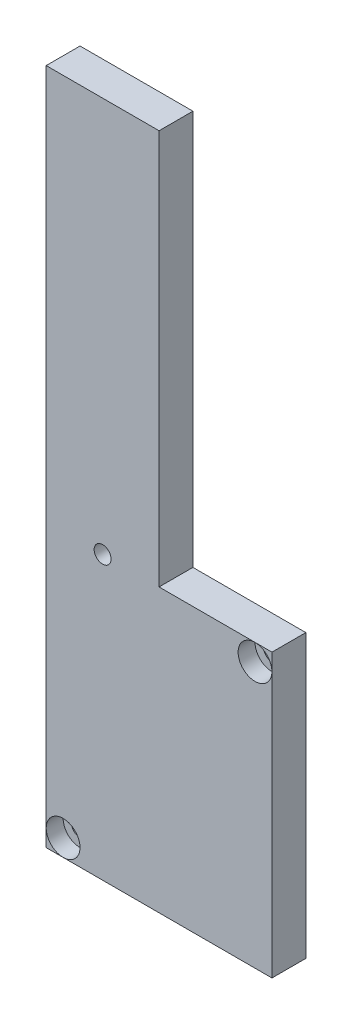
ISO-10303-21;
HEADER;
FILE_DESCRIPTION(('STEP AP214'),'2;1');
FILE_NAME('part.step','',(''),(''),'','','');
FILE_SCHEMA(('AUTOMOTIVE_DESIGN { 1 0 10303 214 1 1 1 1 }'));
ENDSEC;
DATA;
#1=APPLICATION_CONTEXT('core data for automotive mechanical design processes');
#2=APPLICATION_PROTOCOL_DEFINITION('international standard','automotive_design',2000,#1);
#3=PRODUCT_CONTEXT('',#1,'mechanical');
#4=PRODUCT('Part','Part','',(#3));
#5=PRODUCT_RELATED_PRODUCT_CATEGORY('part','',(#4));
#6=PRODUCT_DEFINITION_FORMATION('','',#4);
#7=PRODUCT_DEFINITION_CONTEXT('part definition',#1,'design');
#8=PRODUCT_DEFINITION('design','',#6,#7);
#9=PRODUCT_DEFINITION_SHAPE('','',#8);
#10=(LENGTH_UNIT() NAMED_UNIT(*) SI_UNIT(.MILLI.,.METRE.));
#11=(NAMED_UNIT(*) PLANE_ANGLE_UNIT() SI_UNIT($,.RADIAN.));
#12=(NAMED_UNIT(*) SI_UNIT($,.STERADIAN.) SOLID_ANGLE_UNIT());
#13=UNCERTAINTY_MEASURE_WITH_UNIT(LENGTH_MEASURE(1.E-05),#10,'distance_accuracy_value','');
#14=(GEOMETRIC_REPRESENTATION_CONTEXT(3) GLOBAL_UNCERTAINTY_ASSIGNED_CONTEXT((#13)) GLOBAL_UNIT_ASSIGNED_CONTEXT((#10,
#11,#12)) REPRESENTATION_CONTEXT('',''));
#15=CARTESIAN_POINT('',(0.,0.,0.));
#16=DIRECTION('',(0.,0.,1.));
#17=DIRECTION('',(1.,0.,0.));
#18=AXIS2_PLACEMENT_3D('',#15,#16,#17);
#19=CARTESIAN_POINT('',(37.,47.,0.));
#20=DIRECTION('',(0.,0.,1.));
#21=DIRECTION('',(1.,0.,0.));
#22=AXIS2_PLACEMENT_3D('',#19,#20,#21);
#23=CYLINDRICAL_SURFACE('',#22,1.5);
#24=CARTESIAN_POINT('',(37.,47.,0.));
#25=DIRECTION('',(0.,0.,1.));
#26=DIRECTION('',(1.,0.,0.));
#27=AXIS2_PLACEMENT_3D('',#24,#25,#26);
#28=CIRCLE('',#27,1.5);
#29=CARTESIAN_POINT('',(38.5,47.,0.));
#30=VERTEX_POINT('',#29);
#31=EDGE_CURVE('E125',#30,#30,#28,.T.);
#32=ORIENTED_EDGE('',*,*,#31,.F.);
#33=EDGE_LOOP('',(#32));
#34=FACE_BOUND('',#33,.T.);
#35=CARTESIAN_POINT('',(37.,47.,3.));
#36=DIRECTION('',(0.,0.,1.));
#37=DIRECTION('',(1.,0.,0.));
#38=AXIS2_PLACEMENT_3D('',#35,#36,#37);
#39=CIRCLE('',#38,1.5);
#40=CARTESIAN_POINT('',(38.5,47.,3.));
#41=VERTEX_POINT('',#40);
#42=EDGE_CURVE('E37',#41,#41,#39,.F.);
#43=ORIENTED_EDGE('',*,*,#42,.F.);
#44=EDGE_LOOP('',(#43));
#45=FACE_BOUND('',#44,.T.);
#46=ADVANCED_FACE('F33',(#34,#45),#23,.F.);
#47=CARTESIAN_POINT('',(3.,3.,0.));
#48=DIRECTION('',(0.,0.,1.));
#49=DIRECTION('',(1.,0.,0.));
#50=AXIS2_PLACEMENT_3D('',#47,#48,#49);
#51=CYLINDRICAL_SURFACE('',#50,1.5);
#52=CARTESIAN_POINT('',(3.,3.,0.));
#53=DIRECTION('',(0.,0.,1.));
#54=DIRECTION('',(1.,0.,0.));
#55=AXIS2_PLACEMENT_3D('',#52,#53,#54);
#56=CIRCLE('',#55,1.5);
#57=CARTESIAN_POINT('',(4.5,3.,0.));
#58=VERTEX_POINT('',#57);
#59=EDGE_CURVE('E130',#58,#58,#56,.T.);
#60=ORIENTED_EDGE('',*,*,#59,.F.);
#61=EDGE_LOOP('',(#60));
#62=FACE_BOUND('',#61,.T.);
#63=CARTESIAN_POINT('',(3.,3.,3.));
#64=DIRECTION('',(0.,0.,1.));
#65=DIRECTION('',(1.,0.,0.));
#66=AXIS2_PLACEMENT_3D('',#63,#64,#65);
#67=CIRCLE('',#66,1.5);
#68=CARTESIAN_POINT('',(4.5,3.,3.));
#69=VERTEX_POINT('',#68);
#70=EDGE_CURVE('E123',#69,#69,#67,.F.);
#71=ORIENTED_EDGE('',*,*,#70,.F.);
#72=EDGE_LOOP('',(#71));
#73=FACE_BOUND('',#72,.T.);
#74=ADVANCED_FACE('F169',(#62,#73),#51,.F.);
#75=CARTESIAN_POINT('',(0.,0.,6.));
#76=DIRECTION('',(1.,0.,0.));
#77=DIRECTION('',(0.,0.,-1.));
#78=AXIS2_PLACEMENT_3D('',#75,#76,#77);
#79=PLANE('',#78);
#80=DIRECTION('',(0.,-1.,0.));
#81=VECTOR('',#80,1.);
#82=CARTESIAN_POINT('',(0.,0.,0.));
#83=LINE('',#82,#81);
#84=CARTESIAN_POINT('',(0.,120.,0.));
#85=VERTEX_POINT('',#84);
#86=CARTESIAN_POINT('',(0.,0.,0.));
#87=VERTEX_POINT('',#86);
#88=EDGE_CURVE('E110',#85,#87,#83,.T.);
#89=ORIENTED_EDGE('',*,*,#88,.T.);
#90=DIRECTION('',(0.,0.,-1.));
#91=VECTOR('',#90,1.);
#92=CARTESIAN_POINT('',(0.,0.,6.));
#93=LINE('',#92,#91);
#94=CARTESIAN_POINT('',(0.,0.,6.));
#95=VERTEX_POINT('',#94);
#96=EDGE_CURVE('E11',#95,#87,#93,.T.);
#97=ORIENTED_EDGE('',*,*,#96,.F.);
#98=DIRECTION('',(0.,-1.,0.));
#99=VECTOR('',#98,1.);
#100=CARTESIAN_POINT('',(0.,0.,6.));
#101=LINE('',#100,#99);
#102=CARTESIAN_POINT('',(0.,120.,6.));
#103=VERTEX_POINT('',#102);
#104=EDGE_CURVE('E111',#103,#95,#101,.T.);
#105=ORIENTED_EDGE('',*,*,#104,.F.);
#106=DIRECTION('',(0.,0.,-1.));
#107=VECTOR('',#106,1.);
#108=CARTESIAN_POINT('',(0.,120.,6.));
#109=LINE('',#108,#107);
#110=EDGE_CURVE('E120',#103,#85,#109,.T.);
#111=ORIENTED_EDGE('',*,*,#110,.T.);
#112=EDGE_LOOP('',(#89,#97,#105,#111));
#113=FACE_BOUND('',#112,.T.);
#114=ADVANCED_FACE('F35',(#113),#79,.F.);
#115=CARTESIAN_POINT('',(0.,0.,6.));
#116=DIRECTION('',(0.,1.,0.));
#117=DIRECTION('',(0.,0.,1.));
#118=AXIS2_PLACEMENT_3D('',#115,#116,#117);
#119=PLANE('',#118);
#120=DIRECTION('',(1.,0.,0.));
#121=VECTOR('',#120,1.);
#122=CARTESIAN_POINT('',(0.,0.,0.));
#123=LINE('',#122,#121);
#124=CARTESIAN_POINT('',(40.,0.,0.));
#125=VERTEX_POINT('',#124);
#126=EDGE_CURVE('E116',#87,#125,#123,.T.);
#127=ORIENTED_EDGE('',*,*,#126,.T.);
#128=DIRECTION('',(0.,0.,-1.));
#129=VECTOR('',#128,1.);
#130=CARTESIAN_POINT('',(40.,0.,6.));
#131=LINE('',#130,#129);
#132=CARTESIAN_POINT('',(40.,0.,6.));
#133=VERTEX_POINT('',#132);
#134=EDGE_CURVE('E42',#133,#125,#131,.T.);
#135=ORIENTED_EDGE('',*,*,#134,.F.);
#136=DIRECTION('',(1.,0.,0.));
#137=VECTOR('',#136,1.);
#138=CARTESIAN_POINT('',(0.,0.,6.));
#139=LINE('',#138,#137);
#140=EDGE_CURVE('E82',#95,#133,#139,.T.);
#141=ORIENTED_EDGE('',*,*,#140,.F.);
#142=ORIENTED_EDGE('',*,*,#96,.T.);
#143=EDGE_LOOP('',(#127,#135,#141,#142));
#144=FACE_BOUND('',#143,.T.);
#145=ADVANCED_FACE('F158',(#144),#119,.F.);
#146=CARTESIAN_POINT('',(40.,0.,6.));
#147=DIRECTION('',(-1.,0.,0.));
#148=DIRECTION('',(0.,0.,1.));
#149=AXIS2_PLACEMENT_3D('',#146,#147,#148);
#150=PLANE('',#149);
#151=DIRECTION('',(0.,1.,0.));
#152=VECTOR('',#151,1.);
#153=CARTESIAN_POINT('',(40.,0.,0.));
#154=LINE('',#153,#152);
#155=CARTESIAN_POINT('',(40.,50.,0.));
#156=VERTEX_POINT('',#155);
#157=EDGE_CURVE('E112',#125,#156,#154,.T.);
#158=ORIENTED_EDGE('',*,*,#157,.T.);
#159=DIRECTION('',(0.,0.,1.));
#160=VECTOR('',#159,1.);
#161=CARTESIAN_POINT('',(40.,50.,0.));
#162=LINE('',#161,#160);
#163=CARTESIAN_POINT('',(40.,50.,6.));
#164=VERTEX_POINT('',#163);
#165=EDGE_CURVE('E149',#156,#164,#162,.T.);
#166=ORIENTED_EDGE('',*,*,#165,.T.);
#167=DIRECTION('',(0.,1.,0.));
#168=VECTOR('',#167,1.);
#169=CARTESIAN_POINT('',(40.,0.,6.));
#170=LINE('',#169,#168);
#171=EDGE_CURVE('E154',#133,#164,#170,.T.);
#172=ORIENTED_EDGE('',*,*,#171,.F.);
#173=ORIENTED_EDGE('',*,*,#134,.T.);
#174=EDGE_LOOP('',(#158,#166,#172,#173));
#175=FACE_BOUND('',#174,.T.);
#176=ADVANCED_FACE('F163',(#175),#150,.F.);
#177=CARTESIAN_POINT('',(0.,120.,6.));
#178=DIRECTION('',(0.,-1.,0.));
#179=DIRECTION('',(0.,0.,-1.));
#180=AXIS2_PLACEMENT_3D('',#177,#178,#179);
#181=PLANE('',#180);
#182=DIRECTION('',(-1.,0.,0.));
#183=VECTOR('',#182,1.);
#184=CARTESIAN_POINT('',(0.,120.,6.));
#185=LINE('',#184,#183);
#186=CARTESIAN_POINT('',(20.,120.,6.));
#187=VERTEX_POINT('',#186);
#188=EDGE_CURVE('E59',#187,#103,#185,.T.);
#189=ORIENTED_EDGE('',*,*,#188,.F.);
#190=DIRECTION('',(0.,0.,1.));
#191=VECTOR('',#190,1.);
#192=CARTESIAN_POINT('',(20.,120.,0.));
#193=LINE('',#192,#191);
#194=CARTESIAN_POINT('',(20.,120.,0.));
#195=VERTEX_POINT('',#194);
#196=EDGE_CURVE('E100',#195,#187,#193,.T.);
#197=ORIENTED_EDGE('',*,*,#196,.F.);
#198=DIRECTION('',(-1.,0.,0.));
#199=VECTOR('',#198,1.);
#200=CARTESIAN_POINT('',(0.,120.,0.));
#201=LINE('',#200,#199);
#202=EDGE_CURVE('E77',#195,#85,#201,.T.);
#203=ORIENTED_EDGE('',*,*,#202,.T.);
#204=ORIENTED_EDGE('',*,*,#110,.F.);
#205=EDGE_LOOP('',(#189,#197,#203,#204));
#206=FACE_BOUND('',#205,.T.);
#207=ADVANCED_FACE('F105',(#206),#181,.F.);
#208=CARTESIAN_POINT('',(0.,0.,6.));
#209=DIRECTION('',(0.,0.,-1.));
#210=DIRECTION('',(-1.,0.,0.));
#211=AXIS2_PLACEMENT_3D('',#208,#209,#210);
#212=PLANE('',#211);
#213=CARTESIAN_POINT('',(10.,50.,6.));
#214=DIRECTION('',(0.,0.,1.));
#215=DIRECTION('',(1.,0.,0.));
#216=AXIS2_PLACEMENT_3D('',#213,#214,#215);
#217=CIRCLE('',#216,1.5);
#218=CARTESIAN_POINT('',(11.5,50.,6.));
#219=VERTEX_POINT('',#218);
#220=EDGE_CURVE('E309',#219,#219,#217,.T.);
#221=ORIENTED_EDGE('',*,*,#220,.F.);
#222=EDGE_LOOP('',(#221));
#223=FACE_BOUND('',#222,.T.);
#224=CARTESIAN_POINT('',(37.,47.,6.));
#225=DIRECTION('',(0.,0.,1.));
#226=DIRECTION('',(1.,0.,0.));
#227=AXIS2_PLACEMENT_3D('',#224,#225,#226);
#228=CIRCLE('',#227,2.995);
#229=CARTESIAN_POINT('',(39.995,47.,6.));
#230=VERTEX_POINT('',#229);
#231=EDGE_CURVE('E140',#230,#230,#228,.T.);
#232=ORIENTED_EDGE('',*,*,#231,.F.);
#233=EDGE_LOOP('',(#232));
#234=FACE_BOUND('',#233,.T.);
#235=CARTESIAN_POINT('',(3.,3.,6.));
#236=DIRECTION('',(0.,0.,1.));
#237=DIRECTION('',(1.,0.,0.));
#238=AXIS2_PLACEMENT_3D('',#235,#236,#237);
#239=CIRCLE('',#238,2.995);
#240=CARTESIAN_POINT('',(5.995,3.,6.));
#241=VERTEX_POINT('',#240);
#242=EDGE_CURVE('E133',#241,#241,#239,.T.);
#243=ORIENTED_EDGE('',*,*,#242,.F.);
#244=EDGE_LOOP('',(#243));
#245=FACE_BOUND('',#244,.T.);
#246=ORIENTED_EDGE('',*,*,#171,.T.);
#247=DIRECTION('',(1.,0.,0.));
#248=VECTOR('',#247,1.);
#249=CARTESIAN_POINT('',(40.,50.,6.));
#250=LINE('',#249,#248);
#251=CARTESIAN_POINT('',(20.,50.,6.));
#252=VERTEX_POINT('',#251);
#253=EDGE_CURVE('E103',#252,#164,#250,.T.);
#254=ORIENTED_EDGE('',*,*,#253,.F.);
#255=DIRECTION('',(0.,-1.,0.));
#256=VECTOR('',#255,1.);
#257=CARTESIAN_POINT('',(20.,120.,6.));
#258=LINE('',#257,#256);
#259=EDGE_CURVE('E144',#187,#252,#258,.T.);
#260=ORIENTED_EDGE('',*,*,#259,.F.);
#261=ORIENTED_EDGE('',*,*,#188,.T.);
#262=ORIENTED_EDGE('',*,*,#104,.T.);
#263=ORIENTED_EDGE('',*,*,#140,.T.);
#264=EDGE_LOOP('',(#246,#254,#260,#261,#262,#263));
#265=FACE_BOUND('',#264,.T.);
#266=ADVANCED_FACE('F165',(#223,#234,#245,#265),#212,.F.);
#267=CARTESIAN_POINT('',(0.,0.,0.));
#268=DIRECTION('',(0.,0.,-1.));
#269=DIRECTION('',(-1.,0.,0.));
#270=AXIS2_PLACEMENT_3D('',#267,#268,#269);
#271=PLANE('',#270);
#272=CARTESIAN_POINT('',(10.,50.,0.));
#273=DIRECTION('',(0.,0.,1.));
#274=DIRECTION('',(1.,0.,0.));
#275=AXIS2_PLACEMENT_3D('',#272,#273,#274);
#276=CIRCLE('',#275,1.5);
#277=CARTESIAN_POINT('',(11.5,50.,0.));
#278=VERTEX_POINT('',#277);
#279=EDGE_CURVE('E306',#278,#278,#276,.T.);
#280=ORIENTED_EDGE('',*,*,#279,.T.);
#281=EDGE_LOOP('',(#280));
#282=FACE_BOUND('',#281,.T.);
#283=ORIENTED_EDGE('',*,*,#31,.T.);
#284=EDGE_LOOP('',(#283));
#285=FACE_BOUND('',#284,.T.);
#286=ORIENTED_EDGE('',*,*,#59,.T.);
#287=EDGE_LOOP('',(#286));
#288=FACE_BOUND('',#287,.T.);
#289=DIRECTION('',(1.,0.,0.));
#290=VECTOR('',#289,1.);
#291=CARTESIAN_POINT('',(40.,50.,0.));
#292=LINE('',#291,#290);
#293=CARTESIAN_POINT('',(20.,50.,0.));
#294=VERTEX_POINT('',#293);
#295=EDGE_CURVE('E50',#294,#156,#292,.T.);
#296=ORIENTED_EDGE('',*,*,#295,.T.);
#297=ORIENTED_EDGE('',*,*,#157,.F.);
#298=ORIENTED_EDGE('',*,*,#126,.F.);
#299=ORIENTED_EDGE('',*,*,#88,.F.);
#300=ORIENTED_EDGE('',*,*,#202,.F.);
#301=DIRECTION('',(0.,-1.,0.));
#302=VECTOR('',#301,1.);
#303=CARTESIAN_POINT('',(20.,120.,0.));
#304=LINE('',#303,#302);
#305=EDGE_CURVE('E97',#195,#294,#304,.T.);
#306=ORIENTED_EDGE('',*,*,#305,.T.);
#307=EDGE_LOOP('',(#296,#297,#298,#299,#300,#306));
#308=FACE_BOUND('',#307,.T.);
#309=ADVANCED_FACE('F108',(#282,#285,#288,#308),#271,.T.);
#310=CARTESIAN_POINT('',(40.,50.,0.));
#311=DIRECTION('',(0.,-1.,0.));
#312=DIRECTION('',(0.,0.,-1.));
#313=AXIS2_PLACEMENT_3D('',#310,#311,#312);
#314=PLANE('',#313);
#315=ORIENTED_EDGE('',*,*,#253,.T.);
#316=ORIENTED_EDGE('',*,*,#165,.F.);
#317=ORIENTED_EDGE('',*,*,#295,.F.);
#318=DIRECTION('',(0.,0.,1.));
#319=VECTOR('',#318,1.);
#320=CARTESIAN_POINT('',(20.,50.,0.));
#321=LINE('',#320,#319);
#322=EDGE_CURVE('E101',#294,#252,#321,.T.);
#323=ORIENTED_EDGE('',*,*,#322,.T.);
#324=EDGE_LOOP('',(#315,#316,#317,#323));
#325=FACE_BOUND('',#324,.T.);
#326=ADVANCED_FACE('F187',(#325),#314,.F.);
#327=CARTESIAN_POINT('',(20.,120.,0.));
#328=DIRECTION('',(-1.,0.,0.));
#329=DIRECTION('',(0.,-1.,0.));
#330=AXIS2_PLACEMENT_3D('',#327,#328,#329);
#331=PLANE('',#330);
#332=ORIENTED_EDGE('',*,*,#259,.T.);
#333=ORIENTED_EDGE('',*,*,#322,.F.);
#334=ORIENTED_EDGE('',*,*,#305,.F.);
#335=ORIENTED_EDGE('',*,*,#196,.T.);
#336=EDGE_LOOP('',(#332,#333,#334,#335));
#337=FACE_BOUND('',#336,.T.);
#338=ADVANCED_FACE('F99',(#337),#331,.F.);
#339=CARTESIAN_POINT('',(3.,3.,3.));
#340=DIRECTION('',(0.,0.,1.));
#341=DIRECTION('',(1.,0.,0.));
#342=AXIS2_PLACEMENT_3D('',#339,#340,#341);
#343=PLANE('',#342);
#344=CARTESIAN_POINT('',(3.,3.,3.));
#345=DIRECTION('',(0.,0.,1.));
#346=DIRECTION('',(1.,0.,0.));
#347=AXIS2_PLACEMENT_3D('',#344,#345,#346);
#348=CIRCLE('',#347,2.995);
#349=CARTESIAN_POINT('',(5.995,3.,3.));
#350=VERTEX_POINT('',#349);
#351=EDGE_CURVE('E126',#350,#350,#348,.T.);
#352=ORIENTED_EDGE('',*,*,#351,.T.);
#353=EDGE_LOOP('',(#352));
#354=FACE_BOUND('',#353,.T.);
#355=ORIENTED_EDGE('',*,*,#70,.T.);
#356=EDGE_LOOP('',(#355));
#357=FACE_BOUND('',#356,.T.);
#358=ADVANCED_FACE('F192',(#354,#357),#343,.T.);
#359=CARTESIAN_POINT('',(3.,3.,3.));
#360=DIRECTION('',(0.,0.,1.));
#361=DIRECTION('',(1.,0.,0.));
#362=AXIS2_PLACEMENT_3D('',#359,#360,#361);
#363=CYLINDRICAL_SURFACE('',#362,2.995);
#364=ORIENTED_EDGE('',*,*,#351,.F.);
#365=EDGE_LOOP('',(#364));
#366=FACE_BOUND('',#365,.T.);
#367=ORIENTED_EDGE('',*,*,#242,.T.);
#368=EDGE_LOOP('',(#367));
#369=FACE_BOUND('',#368,.T.);
#370=ADVANCED_FACE('F184',(#366,#369),#363,.F.);
#371=CARTESIAN_POINT('',(37.,47.,3.));
#372=DIRECTION('',(0.,0.,1.));
#373=DIRECTION('',(1.,0.,0.));
#374=AXIS2_PLACEMENT_3D('',#371,#372,#373);
#375=PLANE('',#374);
#376=CARTESIAN_POINT('',(37.,47.,3.));
#377=DIRECTION('',(0.,0.,1.));
#378=DIRECTION('',(1.,0.,0.));
#379=AXIS2_PLACEMENT_3D('',#376,#377,#378);
#380=CIRCLE('',#379,2.995);
#381=CARTESIAN_POINT('',(39.995,47.,3.));
#382=VERTEX_POINT('',#381);
#383=EDGE_CURVE('E312',#382,#382,#380,.T.);
#384=ORIENTED_EDGE('',*,*,#383,.T.);
#385=EDGE_LOOP('',(#384));
#386=FACE_BOUND('',#385,.T.);
#387=ORIENTED_EDGE('',*,*,#42,.T.);
#388=EDGE_LOOP('',(#387));
#389=FACE_BOUND('',#388,.T.);
#390=ADVANCED_FACE('F240',(#386,#389),#375,.T.);
#391=CARTESIAN_POINT('',(37.,47.,3.));
#392=DIRECTION('',(0.,0.,1.));
#393=DIRECTION('',(1.,0.,0.));
#394=AXIS2_PLACEMENT_3D('',#391,#392,#393);
#395=CYLINDRICAL_SURFACE('',#394,2.995);
#396=ORIENTED_EDGE('',*,*,#383,.F.);
#397=EDGE_LOOP('',(#396));
#398=FACE_BOUND('',#397,.T.);
#399=ORIENTED_EDGE('',*,*,#231,.T.);
#400=EDGE_LOOP('',(#399));
#401=FACE_BOUND('',#400,.T.);
#402=ADVANCED_FACE('F247',(#398,#401),#395,.F.);
#403=CARTESIAN_POINT('',(10.,50.,0.));
#404=DIRECTION('',(0.,0.,1.));
#405=DIRECTION('',(1.,0.,0.));
#406=AXIS2_PLACEMENT_3D('',#403,#404,#405);
#407=CYLINDRICAL_SURFACE('',#406,1.5);
#408=ORIENTED_EDGE('',*,*,#279,.F.);
#409=EDGE_LOOP('',(#408));
#410=FACE_BOUND('',#409,.T.);
#411=ORIENTED_EDGE('',*,*,#220,.T.);
#412=EDGE_LOOP('',(#411));
#413=FACE_BOUND('',#412,.T.);
#414=ADVANCED_FACE('F254',(#410,#413),#407,.F.);
#415=CLOSED_SHELL('',(#46,#74,#114,#145,#176,#207,#266,#309,#326,#338,#358,#370,#390,#402,#414));
#416=MANIFOLD_SOLID_BREP('B2',#415);
#417=ADVANCED_BREP_SHAPE_REPRESENTATION('',(#18,#416),#14);
#418=SHAPE_DEFINITION_REPRESENTATION(#9,#417);
ENDSEC;
END-ISO-10303-21;
